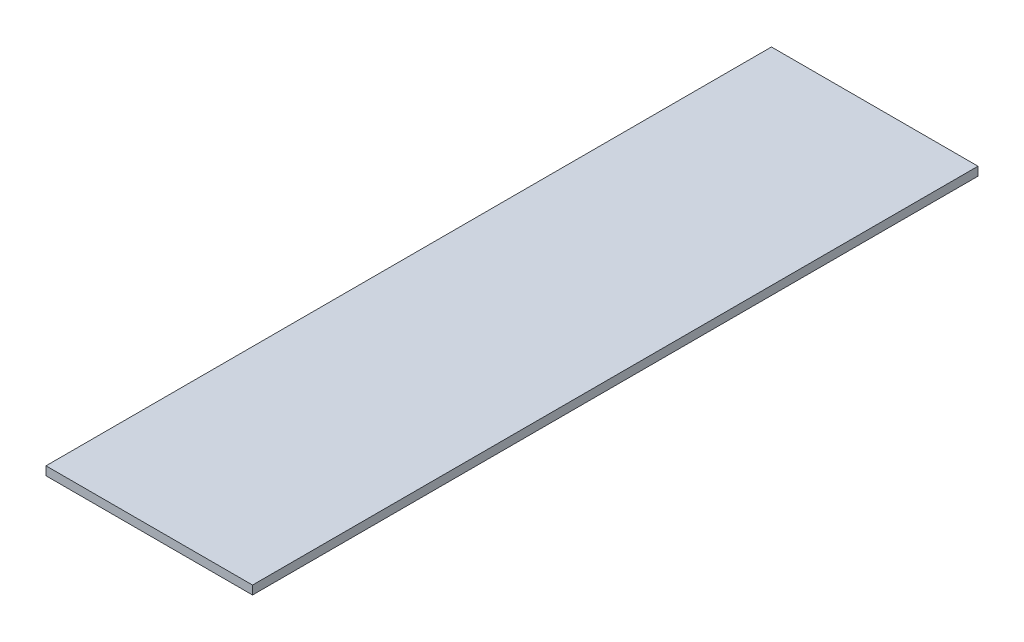
ISO-10303-21;
HEADER;
FILE_DESCRIPTION(('STEP AP214'),'2;1');
FILE_NAME('part.step','',(''),(''),'','','');
FILE_SCHEMA(('AUTOMOTIVE_DESIGN { 1 0 10303 214 1 1 1 1 }'));
ENDSEC;
DATA;
#1=APPLICATION_CONTEXT('core data for automotive mechanical design processes');
#2=APPLICATION_PROTOCOL_DEFINITION('international standard','automotive_design',2000,#1);
#3=PRODUCT_CONTEXT('',#1,'mechanical');
#4=PRODUCT('Part','Part','',(#3));
#5=PRODUCT_RELATED_PRODUCT_CATEGORY('part','',(#4));
#6=PRODUCT_DEFINITION_FORMATION('','',#4);
#7=PRODUCT_DEFINITION_CONTEXT('part definition',#1,'design');
#8=PRODUCT_DEFINITION('design','',#6,#7);
#9=PRODUCT_DEFINITION_SHAPE('','',#8);
#10=(LENGTH_UNIT() NAMED_UNIT(*) SI_UNIT(.MILLI.,.METRE.));
#11=(NAMED_UNIT(*) PLANE_ANGLE_UNIT() SI_UNIT($,.RADIAN.));
#12=(NAMED_UNIT(*) SI_UNIT($,.STERADIAN.) SOLID_ANGLE_UNIT());
#13=UNCERTAINTY_MEASURE_WITH_UNIT(LENGTH_MEASURE(1.E-05),#10,'distance_accuracy_value','');
#14=(GEOMETRIC_REPRESENTATION_CONTEXT(3) GLOBAL_UNCERTAINTY_ASSIGNED_CONTEXT((#13)) GLOBAL_UNIT_ASSIGNED_CONTEXT((#10,
#11,#12)) REPRESENTATION_CONTEXT('',''));
#15=CARTESIAN_POINT('',(0.,0.,0.));
#16=DIRECTION('',(0.,0.,1.));
#17=DIRECTION('',(1.,0.,0.));
#18=AXIS2_PLACEMENT_3D('',#15,#16,#17);
#19=CARTESIAN_POINT('',(357.5,30.,-1255.75));
#20=DIRECTION('',(-1.,0.,0.));
#21=DIRECTION('',(0.,0.,1.));
#22=AXIS2_PLACEMENT_3D('',#19,#20,#21);
#23=PLANE('',#22);
#24=DIRECTION('',(0.,0.,-1.));
#25=VECTOR('',#24,1.);
#26=CARTESIAN_POINT('',(357.5,0.,-1255.75));
#27=LINE('',#26,#25);
#28=CARTESIAN_POINT('',(357.5,0.,1255.75));
#29=VERTEX_POINT('',#28);
#30=CARTESIAN_POINT('',(357.5,0.,-1255.75));
#31=VERTEX_POINT('',#30);
#32=EDGE_CURVE('E98',#29,#31,#27,.T.);
#33=ORIENTED_EDGE('',*,*,#32,.T.);
#34=DIRECTION('',(0.,-1.,0.));
#35=VECTOR('',#34,1.);
#36=CARTESIAN_POINT('',(357.5,30.,-1255.75));
#37=LINE('',#36,#35);
#38=CARTESIAN_POINT('',(357.5,30.,-1255.75));
#39=VERTEX_POINT('',#38);
#40=EDGE_CURVE('E11',#39,#31,#37,.T.);
#41=ORIENTED_EDGE('',*,*,#40,.F.);
#42=DIRECTION('',(0.,0.,-1.));
#43=VECTOR('',#42,1.);
#44=CARTESIAN_POINT('',(357.5,30.,-1255.75));
#45=LINE('',#44,#43);
#46=CARTESIAN_POINT('',(357.5,30.,1255.75));
#47=VERTEX_POINT('',#46);
#48=EDGE_CURVE('E86',#47,#39,#45,.T.);
#49=ORIENTED_EDGE('',*,*,#48,.F.);
#50=DIRECTION('',(0.,-1.,0.));
#51=VECTOR('',#50,1.);
#52=CARTESIAN_POINT('',(357.5,30.,1255.75));
#53=LINE('',#52,#51);
#54=EDGE_CURVE('E94',#47,#29,#53,.T.);
#55=ORIENTED_EDGE('',*,*,#54,.T.);
#56=EDGE_LOOP('',(#33,#41,#49,#55));
#57=FACE_BOUND('',#56,.T.);
#58=ADVANCED_FACE('F35',(#57),#23,.F.);
#59=CARTESIAN_POINT('',(-357.5,30.,-1255.75));
#60=DIRECTION('',(0.,0.,1.));
#61=DIRECTION('',(1.,0.,0.));
#62=AXIS2_PLACEMENT_3D('',#59,#60,#61);
#63=PLANE('',#62);
#64=DIRECTION('',(-1.,0.,0.));
#65=VECTOR('',#64,1.);
#66=CARTESIAN_POINT('',(-357.5,0.,-1255.75));
#67=LINE('',#66,#65);
#68=CARTESIAN_POINT('',(-357.5,0.,-1255.75));
#69=VERTEX_POINT('',#68);
#70=EDGE_CURVE('E90',#31,#69,#67,.T.);
#71=ORIENTED_EDGE('',*,*,#70,.T.);
#72=DIRECTION('',(0.,-1.,0.));
#73=VECTOR('',#72,1.);
#74=CARTESIAN_POINT('',(-357.5,30.,-1255.75));
#75=LINE('',#74,#73);
#76=CARTESIAN_POINT('',(-357.5,30.,-1255.75));
#77=VERTEX_POINT('',#76);
#78=EDGE_CURVE('E43',#77,#69,#75,.T.);
#79=ORIENTED_EDGE('',*,*,#78,.F.);
#80=DIRECTION('',(-1.,0.,0.));
#81=VECTOR('',#80,1.);
#82=CARTESIAN_POINT('',(-357.5,30.,-1255.75));
#83=LINE('',#82,#81);
#84=EDGE_CURVE('E81',#39,#77,#83,.T.);
#85=ORIENTED_EDGE('',*,*,#84,.F.);
#86=ORIENTED_EDGE('',*,*,#40,.T.);
#87=EDGE_LOOP('',(#71,#79,#85,#86));
#88=FACE_BOUND('',#87,.T.);
#89=ADVANCED_FACE('F89',(#88),#63,.F.);
#90=CARTESIAN_POINT('',(-357.5,30.,-1255.75));
#91=DIRECTION('',(1.,0.,0.));
#92=DIRECTION('',(0.,0.,-1.));
#93=AXIS2_PLACEMENT_3D('',#90,#91,#92);
#94=PLANE('',#93);
#95=DIRECTION('',(0.,0.,1.));
#96=VECTOR('',#95,1.);
#97=CARTESIAN_POINT('',(-357.5,0.,-1255.75));
#98=LINE('',#97,#96);
#99=CARTESIAN_POINT('',(-357.5,0.,1255.75));
#100=VERTEX_POINT('',#99);
#101=EDGE_CURVE('E68',#69,#100,#98,.T.);
#102=ORIENTED_EDGE('',*,*,#101,.T.);
#103=DIRECTION('',(0.,-1.,0.));
#104=VECTOR('',#103,1.);
#105=CARTESIAN_POINT('',(-357.5,30.,1255.75));
#106=LINE('',#105,#104);
#107=CARTESIAN_POINT('',(-357.5,30.,1255.75));
#108=VERTEX_POINT('',#107);
#109=EDGE_CURVE('E91',#108,#100,#106,.T.);
#110=ORIENTED_EDGE('',*,*,#109,.F.);
#111=DIRECTION('',(0.,0.,1.));
#112=VECTOR('',#111,1.);
#113=CARTESIAN_POINT('',(-357.5,30.,-1255.75));
#114=LINE('',#113,#112);
#115=EDGE_CURVE('E84',#77,#108,#114,.T.);
#116=ORIENTED_EDGE('',*,*,#115,.F.);
#117=ORIENTED_EDGE('',*,*,#78,.T.);
#118=EDGE_LOOP('',(#102,#110,#116,#117));
#119=FACE_BOUND('',#118,.T.);
#120=ADVANCED_FACE('F92',(#119),#94,.F.);
#121=CARTESIAN_POINT('',(-357.5,30.,1255.75));
#122=DIRECTION('',(0.,0.,-1.));
#123=DIRECTION('',(-1.,0.,0.));
#124=AXIS2_PLACEMENT_3D('',#121,#122,#123);
#125=PLANE('',#124);
#126=DIRECTION('',(1.,0.,0.));
#127=VECTOR('',#126,1.);
#128=CARTESIAN_POINT('',(-357.5,0.,1255.75));
#129=LINE('',#128,#127);
#130=EDGE_CURVE('E74',#100,#29,#129,.T.);
#131=ORIENTED_EDGE('',*,*,#130,.T.);
#132=ORIENTED_EDGE('',*,*,#54,.F.);
#133=DIRECTION('',(1.,0.,0.));
#134=VECTOR('',#133,1.);
#135=CARTESIAN_POINT('',(-357.5,30.,1255.75));
#136=LINE('',#135,#134);
#137=EDGE_CURVE('E51',#108,#47,#136,.T.);
#138=ORIENTED_EDGE('',*,*,#137,.F.);
#139=ORIENTED_EDGE('',*,*,#109,.T.);
#140=EDGE_LOOP('',(#131,#132,#138,#139));
#141=FACE_BOUND('',#140,.T.);
#142=ADVANCED_FACE('F105',(#141),#125,.F.);
#143=CARTESIAN_POINT('',(0.,30.,0.));
#144=DIRECTION('',(0.,1.,0.));
#145=DIRECTION('',(0.,0.,1.));
#146=AXIS2_PLACEMENT_3D('',#143,#144,#145);
#147=PLANE('',#146);
#148=ORIENTED_EDGE('',*,*,#48,.T.);
#149=ORIENTED_EDGE('',*,*,#84,.T.);
#150=ORIENTED_EDGE('',*,*,#115,.T.);
#151=ORIENTED_EDGE('',*,*,#137,.T.);
#152=EDGE_LOOP('',(#148,#149,#150,#151));
#153=FACE_BOUND('',#152,.T.);
#154=ADVANCED_FACE('F82',(#153),#147,.T.);
#155=CARTESIAN_POINT('',(0.,0.,0.));
#156=DIRECTION('',(0.,1.,0.));
#157=DIRECTION('',(0.,0.,1.));
#158=AXIS2_PLACEMENT_3D('',#155,#156,#157);
#159=PLANE('',#158);
#160=ORIENTED_EDGE('',*,*,#32,.F.);
#161=ORIENTED_EDGE('',*,*,#130,.F.);
#162=ORIENTED_EDGE('',*,*,#101,.F.);
#163=ORIENTED_EDGE('',*,*,#70,.F.);
#164=EDGE_LOOP('',(#160,#161,#162,#163));
#165=FACE_BOUND('',#164,.T.);
#166=ADVANCED_FACE('F108',(#165),#159,.F.);
#167=CLOSED_SHELL('',(#58,#89,#120,#142,#154,#166));
#168=MANIFOLD_SOLID_BREP('B2',#167);
#169=ADVANCED_BREP_SHAPE_REPRESENTATION('',(#18,#168),#14);
#170=SHAPE_DEFINITION_REPRESENTATION(#9,#169);
ENDSEC;
END-ISO-10303-21;
